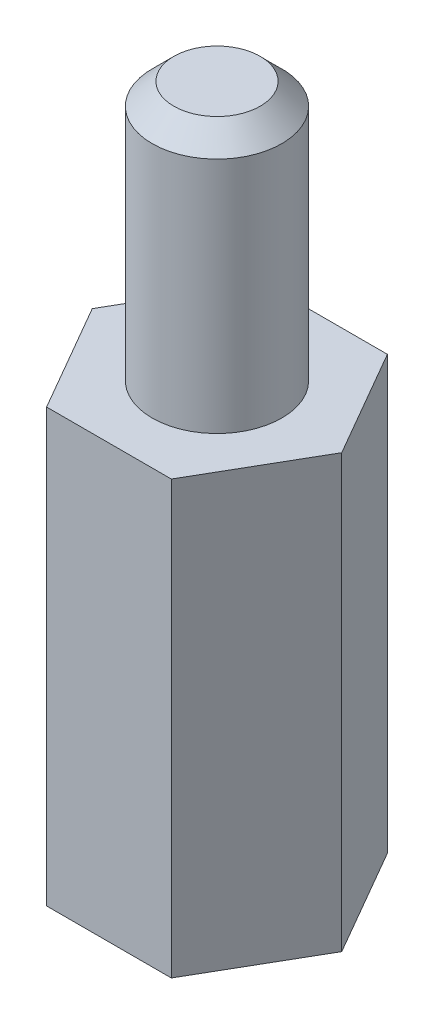
ISO-10303-21;
HEADER;
FILE_DESCRIPTION(('STEP AP214'),'2;1');
FILE_NAME('part.step','',(''),(''),'','','');
FILE_SCHEMA(('AUTOMOTIVE_DESIGN { 1 0 10303 214 1 1 1 1 }'));
ENDSEC;
DATA;
#1=APPLICATION_CONTEXT('core data for automotive mechanical design processes');
#2=APPLICATION_PROTOCOL_DEFINITION('international standard','automotive_design',2000,#1);
#3=PRODUCT_CONTEXT('',#1,'mechanical');
#4=PRODUCT('Part','Part','',(#3));
#5=PRODUCT_RELATED_PRODUCT_CATEGORY('part','',(#4));
#6=PRODUCT_DEFINITION_FORMATION('','',#4);
#7=PRODUCT_DEFINITION_CONTEXT('part definition',#1,'design');
#8=PRODUCT_DEFINITION('design','',#6,#7);
#9=PRODUCT_DEFINITION_SHAPE('','',#8);
#10=(LENGTH_UNIT() NAMED_UNIT(*) SI_UNIT(.MILLI.,.METRE.));
#11=(NAMED_UNIT(*) PLANE_ANGLE_UNIT() SI_UNIT($,.RADIAN.));
#12=(NAMED_UNIT(*) SI_UNIT($,.STERADIAN.) SOLID_ANGLE_UNIT());
#13=UNCERTAINTY_MEASURE_WITH_UNIT(LENGTH_MEASURE(1.E-05),#10,'distance_accuracy_value','');
#14=(GEOMETRIC_REPRESENTATION_CONTEXT(3) GLOBAL_UNCERTAINTY_ASSIGNED_CONTEXT((#13)) GLOBAL_UNIT_ASSIGNED_CONTEXT((#10,
#11,#12)) REPRESENTATION_CONTEXT('',''));
#15=CARTESIAN_POINT('',(0.,0.,0.));
#16=DIRECTION('',(0.,0.,1.));
#17=DIRECTION('',(1.,0.,0.));
#18=AXIS2_PLACEMENT_3D('',#15,#16,#17);
#19=CARTESIAN_POINT('',(-1.44337567297407,10.,2.5));
#20=DIRECTION('',(0.,0.,-1.));
#21=DIRECTION('',(-1.,0.,0.));
#22=AXIS2_PLACEMENT_3D('',#19,#20,#21);
#23=PLANE('',#22);
#24=DIRECTION('',(1.,0.,0.));
#25=VECTOR('',#24,1.);
#26=CARTESIAN_POINT('',(-1.44337567297407,0.,2.5));
#27=LINE('',#26,#25);
#28=CARTESIAN_POINT('',(-1.44337567297407,0.,2.5));
#29=VERTEX_POINT('',#28);
#30=CARTESIAN_POINT('',(1.44337567297406,0.,2.5));
#31=VERTEX_POINT('',#30);
#32=EDGE_CURVE('E124',#29,#31,#27,.T.);
#33=ORIENTED_EDGE('',*,*,#32,.T.);
#34=DIRECTION('',(0.,-1.,0.));
#35=VECTOR('',#34,1.);
#36=CARTESIAN_POINT('',(1.44337567297406,10.,2.5));
#37=LINE('',#36,#35);
#38=CARTESIAN_POINT('',(1.44337567297406,10.,2.5));
#39=VERTEX_POINT('',#38);
#40=EDGE_CURVE('E142',#39,#31,#37,.T.);
#41=ORIENTED_EDGE('',*,*,#40,.F.);
#42=DIRECTION('',(1.,0.,0.));
#43=VECTOR('',#42,1.);
#44=CARTESIAN_POINT('',(-1.44337567297407,10.,2.5));
#45=LINE('',#44,#43);
#46=CARTESIAN_POINT('',(-1.44337567297407,10.,2.5));
#47=VERTEX_POINT('',#46);
#48=EDGE_CURVE('E135',#47,#39,#45,.T.);
#49=ORIENTED_EDGE('',*,*,#48,.F.);
#50=DIRECTION('',(0.,-1.,0.));
#51=VECTOR('',#50,1.);
#52=CARTESIAN_POINT('',(-1.44337567297407,10.,2.5));
#53=LINE('',#52,#51);
#54=EDGE_CURVE('E120',#47,#29,#53,.T.);
#55=ORIENTED_EDGE('',*,*,#54,.T.);
#56=EDGE_LOOP('',(#33,#41,#49,#55));
#57=FACE_BOUND('',#56,.T.);
#58=ADVANCED_FACE('F36',(#57),#23,.F.);
#59=CARTESIAN_POINT('',(1.44337567297406,10.,2.5));
#60=DIRECTION('',(-0.866025403784439,0.,-0.5));
#61=DIRECTION('',(-0.5,0.,0.866025403784439));
#62=AXIS2_PLACEMENT_3D('',#59,#60,#61);
#63=PLANE('',#62);
#64=DIRECTION('',(0.5,0.,-0.866025403784439));
#65=VECTOR('',#64,1.);
#66=CARTESIAN_POINT('',(1.44337567297406,0.,2.5));
#67=LINE('',#66,#65);
#68=CARTESIAN_POINT('',(2.88675134594813,0.,0.));
#69=VERTEX_POINT('',#68);
#70=EDGE_CURVE('E127',#31,#69,#67,.T.);
#71=ORIENTED_EDGE('',*,*,#70,.T.);
#72=DIRECTION('',(0.,-1.,0.));
#73=VECTOR('',#72,1.);
#74=CARTESIAN_POINT('',(2.88675134594813,10.,0.));
#75=LINE('',#74,#73);
#76=CARTESIAN_POINT('',(2.88675134594813,10.,0.));
#77=VERTEX_POINT('',#76);
#78=EDGE_CURVE('E139',#77,#69,#75,.T.);
#79=ORIENTED_EDGE('',*,*,#78,.F.);
#80=DIRECTION('',(0.5,0.,-0.866025403784439));
#81=VECTOR('',#80,1.);
#82=CARTESIAN_POINT('',(1.44337567297406,10.,2.5));
#83=LINE('',#82,#81);
#84=EDGE_CURVE('E92',#39,#77,#83,.T.);
#85=ORIENTED_EDGE('',*,*,#84,.F.);
#86=ORIENTED_EDGE('',*,*,#40,.T.);
#87=EDGE_LOOP('',(#71,#79,#85,#86));
#88=FACE_BOUND('',#87,.T.);
#89=ADVANCED_FACE('F163',(#88),#63,.F.);
#90=CARTESIAN_POINT('',(2.88675134594813,10.,0.));
#91=DIRECTION('',(-0.866025403784439,0.,0.5));
#92=DIRECTION('',(0.5,0.,0.866025403784439));
#93=AXIS2_PLACEMENT_3D('',#90,#91,#92);
#94=PLANE('',#93);
#95=DIRECTION('',(-0.5,0.,-0.866025403784439));
#96=VECTOR('',#95,1.);
#97=CARTESIAN_POINT('',(2.88675134594813,0.,0.));
#98=LINE('',#97,#96);
#99=CARTESIAN_POINT('',(1.44337567297406,0.,-2.5));
#100=VERTEX_POINT('',#99);
#101=EDGE_CURVE('E130',#69,#100,#98,.T.);
#102=ORIENTED_EDGE('',*,*,#101,.T.);
#103=DIRECTION('',(0.,-1.,0.));
#104=VECTOR('',#103,1.);
#105=CARTESIAN_POINT('',(1.44337567297406,10.,-2.5));
#106=LINE('',#105,#104);
#107=CARTESIAN_POINT('',(1.44337567297406,10.,-2.5));
#108=VERTEX_POINT('',#107);
#109=EDGE_CURVE('E115',#108,#100,#106,.T.);
#110=ORIENTED_EDGE('',*,*,#109,.F.);
#111=DIRECTION('',(-0.5,0.,-0.866025403784439));
#112=VECTOR('',#111,1.);
#113=CARTESIAN_POINT('',(2.88675134594813,10.,0.));
#114=LINE('',#113,#112);
#115=EDGE_CURVE('E106',#77,#108,#114,.T.);
#116=ORIENTED_EDGE('',*,*,#115,.F.);
#117=ORIENTED_EDGE('',*,*,#78,.T.);
#118=EDGE_LOOP('',(#102,#110,#116,#117));
#119=FACE_BOUND('',#118,.T.);
#120=ADVANCED_FACE('F169',(#119),#94,.F.);
#121=CARTESIAN_POINT('',(1.44337567297406,10.,-2.5));
#122=DIRECTION('',(0.,0.,1.));
#123=DIRECTION('',(1.,0.,0.));
#124=AXIS2_PLACEMENT_3D('',#121,#122,#123);
#125=PLANE('',#124);
#126=DIRECTION('',(-1.,0.,0.));
#127=VECTOR('',#126,1.);
#128=CARTESIAN_POINT('',(1.44337567297406,0.,-2.5));
#129=LINE('',#128,#127);
#130=CARTESIAN_POINT('',(-1.44337567297407,0.,-2.5));
#131=VERTEX_POINT('',#130);
#132=EDGE_CURVE('E114',#100,#131,#129,.T.);
#133=ORIENTED_EDGE('',*,*,#132,.T.);
#134=DIRECTION('',(0.,-1.,0.));
#135=VECTOR('',#134,1.);
#136=CARTESIAN_POINT('',(-1.44337567297407,10.,-2.5));
#137=LINE('',#136,#135);
#138=CARTESIAN_POINT('',(-1.44337567297407,10.,-2.5));
#139=VERTEX_POINT('',#138);
#140=EDGE_CURVE('E111',#139,#131,#137,.T.);
#141=ORIENTED_EDGE('',*,*,#140,.F.);
#142=DIRECTION('',(-1.,0.,0.));
#143=VECTOR('',#142,1.);
#144=CARTESIAN_POINT('',(1.44337567297406,10.,-2.5));
#145=LINE('',#144,#143);
#146=EDGE_CURVE('E100',#108,#139,#145,.T.);
#147=ORIENTED_EDGE('',*,*,#146,.F.);
#148=ORIENTED_EDGE('',*,*,#109,.T.);
#149=EDGE_LOOP('',(#133,#141,#147,#148));
#150=FACE_BOUND('',#149,.T.);
#151=ADVANCED_FACE('F112',(#150),#125,.F.);
#152=CARTESIAN_POINT('',(-1.44337567297407,10.,-2.5));
#153=DIRECTION('',(0.866025403784439,0.,0.5));
#154=DIRECTION('',(0.5,0.,-0.866025403784439));
#155=AXIS2_PLACEMENT_3D('',#152,#153,#154);
#156=PLANE('',#155);
#157=DIRECTION('',(-0.5,0.,0.866025403784439));
#158=VECTOR('',#157,1.);
#159=CARTESIAN_POINT('',(-1.44337567297407,0.,-2.5));
#160=LINE('',#159,#158);
#161=CARTESIAN_POINT('',(-2.88675134594813,0.,0.));
#162=VERTEX_POINT('',#161);
#163=EDGE_CURVE('E77',#131,#162,#160,.T.);
#164=ORIENTED_EDGE('',*,*,#163,.T.);
#165=DIRECTION('',(0.,-1.,0.));
#166=VECTOR('',#165,1.);
#167=CARTESIAN_POINT('',(-2.88675134594813,10.,0.));
#168=LINE('',#167,#166);
#169=CARTESIAN_POINT('',(-2.88675134594813,10.,0.));
#170=VERTEX_POINT('',#169);
#171=EDGE_CURVE('E116',#170,#162,#168,.T.);
#172=ORIENTED_EDGE('',*,*,#171,.F.);
#173=DIRECTION('',(-0.5,0.,0.866025403784439));
#174=VECTOR('',#173,1.);
#175=CARTESIAN_POINT('',(-1.44337567297407,10.,-2.5));
#176=LINE('',#175,#174);
#177=EDGE_CURVE('E104',#139,#170,#176,.T.);
#178=ORIENTED_EDGE('',*,*,#177,.F.);
#179=ORIENTED_EDGE('',*,*,#140,.T.);
#180=EDGE_LOOP('',(#164,#172,#178,#179));
#181=FACE_BOUND('',#180,.T.);
#182=ADVANCED_FACE('F118',(#181),#156,.F.);
#183=CARTESIAN_POINT('',(-2.88675134594813,10.,0.));
#184=DIRECTION('',(0.866025403784439,0.,-0.5));
#185=DIRECTION('',(-0.5,0.,-0.866025403784439));
#186=AXIS2_PLACEMENT_3D('',#183,#184,#185);
#187=PLANE('',#186);
#188=DIRECTION('',(0.5,0.,0.866025403784439));
#189=VECTOR('',#188,1.);
#190=CARTESIAN_POINT('',(-2.88675134594813,0.,0.));
#191=LINE('',#190,#189);
#192=EDGE_CURVE('E83',#162,#29,#191,.T.);
#193=ORIENTED_EDGE('',*,*,#192,.T.);
#194=ORIENTED_EDGE('',*,*,#54,.F.);
#195=DIRECTION('',(0.5,0.,0.866025403784439));
#196=VECTOR('',#195,1.);
#197=CARTESIAN_POINT('',(-2.88675134594813,10.,0.));
#198=LINE('',#197,#196);
#199=EDGE_CURVE('E53',#170,#47,#198,.T.);
#200=ORIENTED_EDGE('',*,*,#199,.F.);
#201=ORIENTED_EDGE('',*,*,#171,.T.);
#202=EDGE_LOOP('',(#193,#194,#200,#201));
#203=FACE_BOUND('',#202,.T.);
#204=ADVANCED_FACE('F179',(#203),#187,.F.);
#205=CARTESIAN_POINT('',(0.,10.,0.));
#206=DIRECTION('',(0.,1.,0.));
#207=DIRECTION('',(0.,0.,1.));
#208=AXIS2_PLACEMENT_3D('',#205,#206,#207);
#209=PLANE('',#208);
#210=CARTESIAN_POINT('',(0.,10.,0.));
#211=DIRECTION('',(0.,1.,0.));
#212=DIRECTION('',(0.,0.,1.));
#213=AXIS2_PLACEMENT_3D('',#210,#211,#212);
#214=CIRCLE('',#213,1.5);
#215=CARTESIAN_POINT('',(0.,10.,1.5));
#216=VERTEX_POINT('',#215);
#217=EDGE_CURVE('E287',#216,#216,#214,.T.);
#218=ORIENTED_EDGE('',*,*,#217,.F.);
#219=EDGE_LOOP('',(#218));
#220=FACE_BOUND('',#219,.T.);
#221=ORIENTED_EDGE('',*,*,#48,.T.);
#222=ORIENTED_EDGE('',*,*,#84,.T.);
#223=ORIENTED_EDGE('',*,*,#115,.T.);
#224=ORIENTED_EDGE('',*,*,#146,.T.);
#225=ORIENTED_EDGE('',*,*,#177,.T.);
#226=ORIENTED_EDGE('',*,*,#199,.T.);
#227=EDGE_LOOP('',(#221,#222,#223,#224,#225,#226));
#228=FACE_BOUND('',#227,.T.);
#229=ADVANCED_FACE('F102',(#220,#228),#209,.T.);
#230=CARTESIAN_POINT('',(0.,0.,0.));
#231=DIRECTION('',(0.,1.,0.));
#232=DIRECTION('',(0.,0.,1.));
#233=AXIS2_PLACEMENT_3D('',#230,#231,#232);
#234=PLANE('',#233);
#235=CARTESIAN_POINT('',(0.,0.,0.));
#236=DIRECTION('',(0.,1.,0.));
#237=DIRECTION('',(0.,0.,1.));
#238=AXIS2_PLACEMENT_3D('',#235,#236,#237);
#239=CIRCLE('',#238,1.99999999999999);
#240=CARTESIAN_POINT('',(0.,0.,1.99999999999999));
#241=VERTEX_POINT('',#240);
#242=EDGE_CURVE('E147',#241,#241,#239,.T.);
#243=ORIENTED_EDGE('',*,*,#242,.T.);
#244=EDGE_LOOP('',(#243));
#245=FACE_BOUND('',#244,.T.);
#246=ORIENTED_EDGE('',*,*,#32,.F.);
#247=ORIENTED_EDGE('',*,*,#192,.F.);
#248=ORIENTED_EDGE('',*,*,#163,.F.);
#249=ORIENTED_EDGE('',*,*,#132,.F.);
#250=ORIENTED_EDGE('',*,*,#101,.F.);
#251=ORIENTED_EDGE('',*,*,#70,.F.);
#252=EDGE_LOOP('',(#246,#247,#248,#249,#250,#251));
#253=FACE_BOUND('',#252,.T.);
#254=ADVANCED_FACE('F182',(#245,#253),#234,.F.);
#255=CARTESIAN_POINT('',(0.,8.5,0.));
#256=DIRECTION('',(0.,-1.,0.));
#257=DIRECTION('',(0.,0.,-1.));
#258=AXIS2_PLACEMENT_3D('',#255,#256,#257);
#259=CONICAL_SURFACE('',#258,1.5,1.02974425867665);
#260=CARTESIAN_POINT('',(0.,9.40129092854134,0.));
#261=VERTEX_POINT('',#260);
#262=VERTEX_LOOP('',#261);
#263=FACE_BOUND('',#262,.T.);
#264=CARTESIAN_POINT('',(0.,8.5,0.));
#265=DIRECTION('',(0.,-1.,0.));
#266=DIRECTION('',(0.,0.,-1.));
#267=AXIS2_PLACEMENT_3D('',#264,#265,#266);
#268=CIRCLE('',#267,1.5);
#269=CARTESIAN_POINT('',(0.,8.5,-1.5));
#270=VERTEX_POINT('',#269);
#271=EDGE_CURVE('E128',#270,#270,#268,.T.);
#272=ORIENTED_EDGE('',*,*,#271,.T.);
#273=EDGE_LOOP('',(#272));
#274=FACE_BOUND('',#273,.T.);
#275=ADVANCED_FACE('F185',(#263,#274),#259,.F.);
#276=CARTESIAN_POINT('',(0.,0.,0.));
#277=DIRECTION('',(0.,-1.,0.));
#278=DIRECTION('',(0.,0.,-1.));
#279=AXIS2_PLACEMENT_3D('',#276,#277,#278);
#280=CYLINDRICAL_SURFACE('',#279,1.49999999999999);
#281=CARTESIAN_POINT('',(0.,0.499999999999991,0.));
#282=DIRECTION('',(0.,1.,0.));
#283=DIRECTION('',(0.,0.,1.));
#284=AXIS2_PLACEMENT_3D('',#281,#282,#283);
#285=CIRCLE('',#284,1.49999999999999);
#286=CARTESIAN_POINT('',(0.,0.499999999999991,1.49999999999999));
#287=VERTEX_POINT('',#286);
#288=EDGE_CURVE('E144',#287,#287,#285,.F.);
#289=ORIENTED_EDGE('',*,*,#288,.T.);
#290=EDGE_LOOP('',(#289));
#291=FACE_BOUND('',#290,.T.);
#292=ORIENTED_EDGE('',*,*,#271,.F.);
#293=EDGE_LOOP('',(#292));
#294=FACE_BOUND('',#293,.T.);
#295=ADVANCED_FACE('F192',(#291,#294),#280,.F.);
#296=CARTESIAN_POINT('',(0.,16.,0.));
#297=DIRECTION('',(0.,-1.,0.));
#298=DIRECTION('',(0.,0.,-1.));
#299=AXIS2_PLACEMENT_3D('',#296,#297,#298);
#300=CYLINDRICAL_SURFACE('',#299,1.5);
#301=CARTESIAN_POINT('',(0.,15.5,0.));
#302=DIRECTION('',(0.,1.,0.));
#303=DIRECTION('',(0.,0.,1.));
#304=AXIS2_PLACEMENT_3D('',#301,#302,#303);
#305=CIRCLE('',#304,1.5);
#306=CARTESIAN_POINT('',(0.,15.5,1.5));
#307=VERTEX_POINT('',#306);
#308=EDGE_CURVE('E11',#307,#307,#305,.F.);
#309=ORIENTED_EDGE('',*,*,#308,.T.);
#310=EDGE_LOOP('',(#309));
#311=FACE_BOUND('',#310,.T.);
#312=ORIENTED_EDGE('',*,*,#217,.T.);
#313=EDGE_LOOP('',(#312));
#314=FACE_BOUND('',#313,.T.);
#315=ADVANCED_FACE('F196',(#311,#314),#300,.T.);
#316=CARTESIAN_POINT('',(0.,16.,0.));
#317=DIRECTION('',(0.,1.,0.));
#318=DIRECTION('',(0.,0.,1.));
#319=AXIS2_PLACEMENT_3D('',#316,#317,#318);
#320=PLANE('',#319);
#321=CARTESIAN_POINT('',(0.,16.,0.));
#322=DIRECTION('',(0.,1.,0.));
#323=DIRECTION('',(0.,0.,1.));
#324=AXIS2_PLACEMENT_3D('',#321,#322,#323);
#325=CIRCLE('',#324,0.999999999999999);
#326=CARTESIAN_POINT('',(0.,16.,0.999999999999999));
#327=VERTEX_POINT('',#326);
#328=EDGE_CURVE('E45',#327,#327,#325,.T.);
#329=ORIENTED_EDGE('',*,*,#328,.T.);
#330=EDGE_LOOP('',(#329));
#331=FACE_BOUND('',#330,.T.);
#332=ADVANCED_FACE('F152',(#331),#320,.T.);
#333=CARTESIAN_POINT('',(0.,0.499999999999991,0.));
#334=DIRECTION('',(0.,-1.,0.));
#335=DIRECTION('',(0.,0.,-1.));
#336=AXIS2_PLACEMENT_3D('',#333,#334,#335);
#337=CONICAL_SURFACE('',#336,1.49999999999999,0.785398163397452);
#338=ORIENTED_EDGE('',*,*,#242,.F.);
#339=EDGE_LOOP('',(#338));
#340=FACE_BOUND('',#339,.T.);
#341=ORIENTED_EDGE('',*,*,#288,.F.);
#342=EDGE_LOOP('',(#341));
#343=FACE_BOUND('',#342,.T.);
#344=ADVANCED_FACE('F155',(#340,#343),#337,.F.);
#345=CARTESIAN_POINT('',(0.,16.,0.));
#346=DIRECTION('',(0.,-1.,0.));
#347=DIRECTION('',(0.,0.,-1.));
#348=AXIS2_PLACEMENT_3D('',#345,#346,#347);
#349=CONICAL_SURFACE('',#348,0.999999999999999,0.785398163397446);
#350=ORIENTED_EDGE('',*,*,#308,.F.);
#351=EDGE_LOOP('',(#350));
#352=FACE_BOUND('',#351,.T.);
#353=ORIENTED_EDGE('',*,*,#328,.F.);
#354=EDGE_LOOP('',(#353));
#355=FACE_BOUND('',#354,.T.);
#356=ADVANCED_FACE('F38',(#352,#355),#349,.T.);
#357=CLOSED_SHELL('',(#58,#89,#120,#151,#182,#204,#229,#254,#275,#295,#315,#332,#344,#356));
#358=MANIFOLD_SOLID_BREP('B2',#357);
#359=ADVANCED_BREP_SHAPE_REPRESENTATION('',(#18,#358),#14);
#360=SHAPE_DEFINITION_REPRESENTATION(#9,#359);
ENDSEC;
END-ISO-10303-21;
